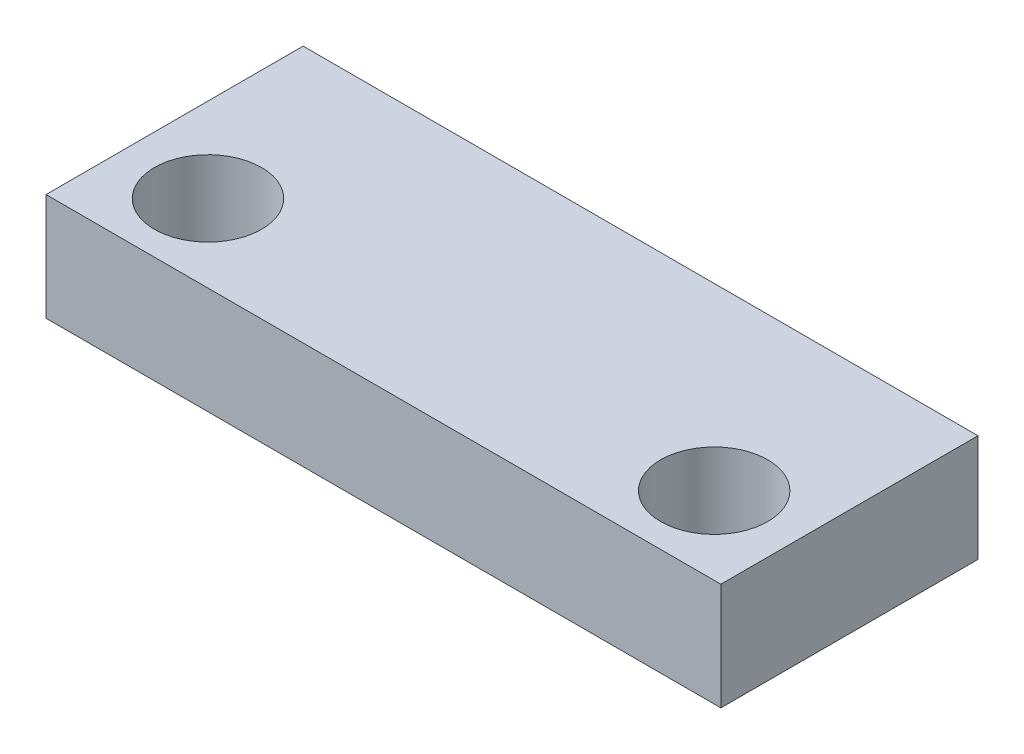
ISO-10303-21;
HEADER;
FILE_DESCRIPTION(('STEP AP214'),'2;1');
FILE_NAME('part.step','',(''),(''),'','','');
FILE_SCHEMA(('AUTOMOTIVE_DESIGN { 1 0 10303 214 1 1 1 1 }'));
ENDSEC;
DATA;
#1=APPLICATION_CONTEXT('core data for automotive mechanical design processes');
#2=APPLICATION_PROTOCOL_DEFINITION('international standard','automotive_design',2000,#1);
#3=PRODUCT_CONTEXT('',#1,'mechanical');
#4=PRODUCT('Part','Part','',(#3));
#5=PRODUCT_RELATED_PRODUCT_CATEGORY('part','',(#4));
#6=PRODUCT_DEFINITION_FORMATION('','',#4);
#7=PRODUCT_DEFINITION_CONTEXT('part definition',#1,'design');
#8=PRODUCT_DEFINITION('design','',#6,#7);
#9=PRODUCT_DEFINITION_SHAPE('','',#8);
#10=(LENGTH_UNIT() NAMED_UNIT(*) SI_UNIT(.MILLI.,.METRE.));
#11=(NAMED_UNIT(*) PLANE_ANGLE_UNIT() SI_UNIT($,.RADIAN.));
#12=(NAMED_UNIT(*) SI_UNIT($,.STERADIAN.) SOLID_ANGLE_UNIT());
#13=UNCERTAINTY_MEASURE_WITH_UNIT(LENGTH_MEASURE(1.E-05),#10,'distance_accuracy_value','');
#14=(GEOMETRIC_REPRESENTATION_CONTEXT(3) GLOBAL_UNCERTAINTY_ASSIGNED_CONTEXT((#13)) GLOBAL_UNIT_ASSIGNED_CONTEXT((#10,
#11,#12)) REPRESENTATION_CONTEXT('',''));
#15=CARTESIAN_POINT('',(0.,0.,0.));
#16=DIRECTION('',(0.,0.,1.));
#17=DIRECTION('',(1.,0.,0.));
#18=AXIS2_PLACEMENT_3D('',#15,#16,#17);
#19=CARTESIAN_POINT('',(19.99996,-3.175,0.));
#20=DIRECTION('',(0.,0.,1.));
#21=DIRECTION('',(1.,0.,0.));
#22=AXIS2_PLACEMENT_3D('',#19,#20,#21);
#23=PLANE('',#22);
#24=DIRECTION('',(1.,0.,0.));
#25=VECTOR('',#24,1.);
#26=CARTESIAN_POINT('',(19.99996,0.,0.));
#27=LINE('',#26,#25);
#28=CARTESIAN_POINT('',(0.,0.,0.));
#29=VERTEX_POINT('',#28);
#30=CARTESIAN_POINT('',(19.99996,0.,0.));
#31=VERTEX_POINT('',#30);
#32=EDGE_CURVE('E116',#29,#31,#27,.T.);
#33=ORIENTED_EDGE('',*,*,#32,.F.);
#34=DIRECTION('',(0.,1.,0.));
#35=VECTOR('',#34,1.);
#36=CARTESIAN_POINT('',(0.,-3.175,0.));
#37=LINE('',#36,#35);
#38=CARTESIAN_POINT('',(0.,-3.175,0.));
#39=VERTEX_POINT('',#38);
#40=EDGE_CURVE('E11',#39,#29,#37,.T.);
#41=ORIENTED_EDGE('',*,*,#40,.F.);
#42=DIRECTION('',(1.,0.,0.));
#43=VECTOR('',#42,1.);
#44=CARTESIAN_POINT('',(19.99996,-3.175,0.));
#45=LINE('',#44,#43);
#46=CARTESIAN_POINT('',(19.99996,-3.175,0.));
#47=VERTEX_POINT('',#46);
#48=EDGE_CURVE('E107',#39,#47,#45,.T.);
#49=ORIENTED_EDGE('',*,*,#48,.T.);
#50=DIRECTION('',(0.,1.,0.));
#51=VECTOR('',#50,1.);
#52=CARTESIAN_POINT('',(19.99996,-3.175,0.));
#53=LINE('',#52,#51);
#54=EDGE_CURVE('E48',#47,#31,#53,.T.);
#55=ORIENTED_EDGE('',*,*,#54,.T.);
#56=EDGE_LOOP('',(#33,#41,#49,#55));
#57=FACE_BOUND('',#56,.T.);
#58=ADVANCED_FACE('F45',(#57),#23,.T.);
#59=CARTESIAN_POINT('',(0.,-3.175,0.));
#60=DIRECTION('',(-1.,0.,0.));
#61=DIRECTION('',(0.,0.,1.));
#62=AXIS2_PLACEMENT_3D('',#59,#60,#61);
#63=PLANE('',#62);
#64=DIRECTION('',(0.,0.,1.));
#65=VECTOR('',#64,1.);
#66=CARTESIAN_POINT('',(0.,0.,0.));
#67=LINE('',#66,#65);
#68=CARTESIAN_POINT('',(0.,0.,-7.62));
#69=VERTEX_POINT('',#68);
#70=EDGE_CURVE('E110',#69,#29,#67,.T.);
#71=ORIENTED_EDGE('',*,*,#70,.F.);
#72=DIRECTION('',(0.,1.,0.));
#73=VECTOR('',#72,1.);
#74=CARTESIAN_POINT('',(0.,-3.175,-7.62));
#75=LINE('',#74,#73);
#76=CARTESIAN_POINT('',(0.,-3.175,-7.62));
#77=VERTEX_POINT('',#76);
#78=EDGE_CURVE('E55',#77,#69,#75,.T.);
#79=ORIENTED_EDGE('',*,*,#78,.F.);
#80=DIRECTION('',(0.,0.,1.));
#81=VECTOR('',#80,1.);
#82=CARTESIAN_POINT('',(0.,-3.175,0.));
#83=LINE('',#82,#81);
#84=EDGE_CURVE('E102',#77,#39,#83,.T.);
#85=ORIENTED_EDGE('',*,*,#84,.T.);
#86=ORIENTED_EDGE('',*,*,#40,.T.);
#87=EDGE_LOOP('',(#71,#79,#85,#86));
#88=FACE_BOUND('',#87,.T.);
#89=ADVANCED_FACE('F133',(#88),#63,.T.);
#90=CARTESIAN_POINT('',(0.,-3.175,-7.62));
#91=DIRECTION('',(0.,0.,-1.));
#92=DIRECTION('',(-1.,0.,0.));
#93=AXIS2_PLACEMENT_3D('',#90,#91,#92);
#94=PLANE('',#93);
#95=DIRECTION('',(-1.,0.,0.));
#96=VECTOR('',#95,1.);
#97=CARTESIAN_POINT('',(0.,0.,-7.62));
#98=LINE('',#97,#96);
#99=CARTESIAN_POINT('',(19.99996,0.,-7.62));
#100=VERTEX_POINT('',#99);
#101=EDGE_CURVE('E96',#100,#69,#98,.T.);
#102=ORIENTED_EDGE('',*,*,#101,.F.);
#103=DIRECTION('',(0.,1.,0.));
#104=VECTOR('',#103,1.);
#105=CARTESIAN_POINT('',(19.99996,-3.175,-7.62));
#106=LINE('',#105,#104);
#107=CARTESIAN_POINT('',(19.99996,-3.175,-7.62));
#108=VERTEX_POINT('',#107);
#109=EDGE_CURVE('E91',#108,#100,#106,.T.);
#110=ORIENTED_EDGE('',*,*,#109,.F.);
#111=DIRECTION('',(-1.,0.,0.));
#112=VECTOR('',#111,1.);
#113=CARTESIAN_POINT('',(0.,-3.175,-7.62));
#114=LINE('',#113,#112);
#115=EDGE_CURVE('E94',#108,#77,#114,.T.);
#116=ORIENTED_EDGE('',*,*,#115,.T.);
#117=ORIENTED_EDGE('',*,*,#78,.T.);
#118=EDGE_LOOP('',(#102,#110,#116,#117));
#119=FACE_BOUND('',#118,.T.);
#120=ADVANCED_FACE('F93',(#119),#94,.T.);
#121=CARTESIAN_POINT('',(19.99996,-3.175,-7.62));
#122=DIRECTION('',(1.,0.,0.));
#123=DIRECTION('',(0.,0.,-1.));
#124=AXIS2_PLACEMENT_3D('',#121,#122,#123);
#125=PLANE('',#124);
#126=DIRECTION('',(0.,0.,-1.));
#127=VECTOR('',#126,1.);
#128=CARTESIAN_POINT('',(19.99996,0.,-7.62));
#129=LINE('',#128,#127);
#130=EDGE_CURVE('E120',#31,#100,#129,.T.);
#131=ORIENTED_EDGE('',*,*,#130,.F.);
#132=ORIENTED_EDGE('',*,*,#54,.F.);
#133=DIRECTION('',(0.,0.,-1.));
#134=VECTOR('',#133,1.);
#135=CARTESIAN_POINT('',(19.99996,-3.175,-7.62));
#136=LINE('',#135,#134);
#137=EDGE_CURVE('E101',#47,#108,#136,.T.);
#138=ORIENTED_EDGE('',*,*,#137,.T.);
#139=ORIENTED_EDGE('',*,*,#109,.T.);
#140=EDGE_LOOP('',(#131,#132,#138,#139));
#141=FACE_BOUND('',#140,.T.);
#142=ADVANCED_FACE('F105',(#141),#125,.T.);
#143=CARTESIAN_POINT('',(0.,-3.175,0.));
#144=DIRECTION('',(0.,-1.,0.));
#145=DIRECTION('',(0.,0.,-1.));
#146=AXIS2_PLACEMENT_3D('',#143,#144,#145);
#147=PLANE('',#146);
#148=CARTESIAN_POINT('',(2.49936,-3.175,-2.30124));
#149=DIRECTION('',(0.,1.,0.));
#150=DIRECTION('',(0.,0.,-1.));
#151=AXIS2_PLACEMENT_3D('',#148,#149,#150);
#152=CIRCLE('',#151,1.5875);
#153=CARTESIAN_POINT('',(2.49936,-3.175,-3.88874));
#154=VERTEX_POINT('',#153);
#155=EDGE_CURVE('E166',#154,#154,#152,.T.);
#156=ORIENTED_EDGE('',*,*,#155,.T.);
#157=EDGE_LOOP('',(#156));
#158=FACE_BOUND('',#157,.T.);
#159=CARTESIAN_POINT('',(17.5006,-3.175,-2.30124));
#160=DIRECTION('',(0.,1.,0.));
#161=DIRECTION('',(0.,0.,1.));
#162=AXIS2_PLACEMENT_3D('',#159,#160,#161);
#163=CIRCLE('',#162,1.5875);
#164=CARTESIAN_POINT('',(17.5006,-3.175,-0.713740000000001));
#165=VERTEX_POINT('',#164);
#166=EDGE_CURVE('E121',#165,#165,#163,.T.);
#167=ORIENTED_EDGE('',*,*,#166,.T.);
#168=EDGE_LOOP('',(#167));
#169=FACE_BOUND('',#168,.T.);
#170=ORIENTED_EDGE('',*,*,#48,.F.);
#171=ORIENTED_EDGE('',*,*,#84,.F.);
#172=ORIENTED_EDGE('',*,*,#115,.F.);
#173=ORIENTED_EDGE('',*,*,#137,.F.);
#174=EDGE_LOOP('',(#170,#171,#172,#173));
#175=FACE_BOUND('',#174,.T.);
#176=ADVANCED_FACE('F100',(#158,#169,#175),#147,.T.);
#177=CARTESIAN_POINT('',(0.,0.,0.));
#178=DIRECTION('',(0.,-1.,0.));
#179=DIRECTION('',(0.,0.,-1.));
#180=AXIS2_PLACEMENT_3D('',#177,#178,#179);
#181=PLANE('',#180);
#182=CARTESIAN_POINT('',(2.49936,0.,-2.30124));
#183=DIRECTION('',(0.,1.,0.));
#184=DIRECTION('',(0.,0.,-1.));
#185=AXIS2_PLACEMENT_3D('',#182,#183,#184);
#186=CIRCLE('',#185,1.5875);
#187=CARTESIAN_POINT('',(2.49936,0.,-3.88874));
#188=VERTEX_POINT('',#187);
#189=EDGE_CURVE('E169',#188,#188,#186,.T.);
#190=ORIENTED_EDGE('',*,*,#189,.F.);
#191=EDGE_LOOP('',(#190));
#192=FACE_BOUND('',#191,.T.);
#193=CARTESIAN_POINT('',(17.5006,0.,-2.30124));
#194=DIRECTION('',(0.,1.,0.));
#195=DIRECTION('',(0.,0.,1.));
#196=AXIS2_PLACEMENT_3D('',#193,#194,#195);
#197=CIRCLE('',#196,1.5875);
#198=CARTESIAN_POINT('',(17.5006,0.,-0.713740000000001));
#199=VERTEX_POINT('',#198);
#200=EDGE_CURVE('E173',#199,#199,#197,.T.);
#201=ORIENTED_EDGE('',*,*,#200,.F.);
#202=EDGE_LOOP('',(#201));
#203=FACE_BOUND('',#202,.T.);
#204=ORIENTED_EDGE('',*,*,#32,.T.);
#205=ORIENTED_EDGE('',*,*,#130,.T.);
#206=ORIENTED_EDGE('',*,*,#101,.T.);
#207=ORIENTED_EDGE('',*,*,#70,.T.);
#208=EDGE_LOOP('',(#204,#205,#206,#207));
#209=FACE_BOUND('',#208,.T.);
#210=ADVANCED_FACE('F132',(#192,#203,#209),#181,.F.);
#211=CARTESIAN_POINT('',(17.5006,-3.175,-2.30124));
#212=DIRECTION('',(0.,1.,0.));
#213=DIRECTION('',(0.,0.,1.));
#214=AXIS2_PLACEMENT_3D('',#211,#212,#213);
#215=CYLINDRICAL_SURFACE('',#214,1.5875);
#216=ORIENTED_EDGE('',*,*,#166,.F.);
#217=EDGE_LOOP('',(#216));
#218=FACE_BOUND('',#217,.T.);
#219=ORIENTED_EDGE('',*,*,#200,.T.);
#220=EDGE_LOOP('',(#219));
#221=FACE_BOUND('',#220,.T.);
#222=ADVANCED_FACE('F151',(#218,#221),#215,.F.);
#223=CARTESIAN_POINT('',(2.49936,-3.175,-2.30124));
#224=DIRECTION('',(0.,1.,0.));
#225=DIRECTION('',(0.,0.,1.));
#226=AXIS2_PLACEMENT_3D('',#223,#224,#225);
#227=CYLINDRICAL_SURFACE('',#226,1.5875);
#228=ORIENTED_EDGE('',*,*,#155,.F.);
#229=EDGE_LOOP('',(#228));
#230=FACE_BOUND('',#229,.T.);
#231=ORIENTED_EDGE('',*,*,#189,.T.);
#232=EDGE_LOOP('',(#231));
#233=FACE_BOUND('',#232,.T.);
#234=ADVANCED_FACE('F158',(#230,#233),#227,.F.);
#235=CLOSED_SHELL('',(#58,#89,#120,#142,#176,#210,#222,#234));
#236=MANIFOLD_SOLID_BREP('B2',#235);
#237=ADVANCED_BREP_SHAPE_REPRESENTATION('',(#18,#236),#14);
#238=SHAPE_DEFINITION_REPRESENTATION(#9,#237);
ENDSEC;
END-ISO-10303-21;
